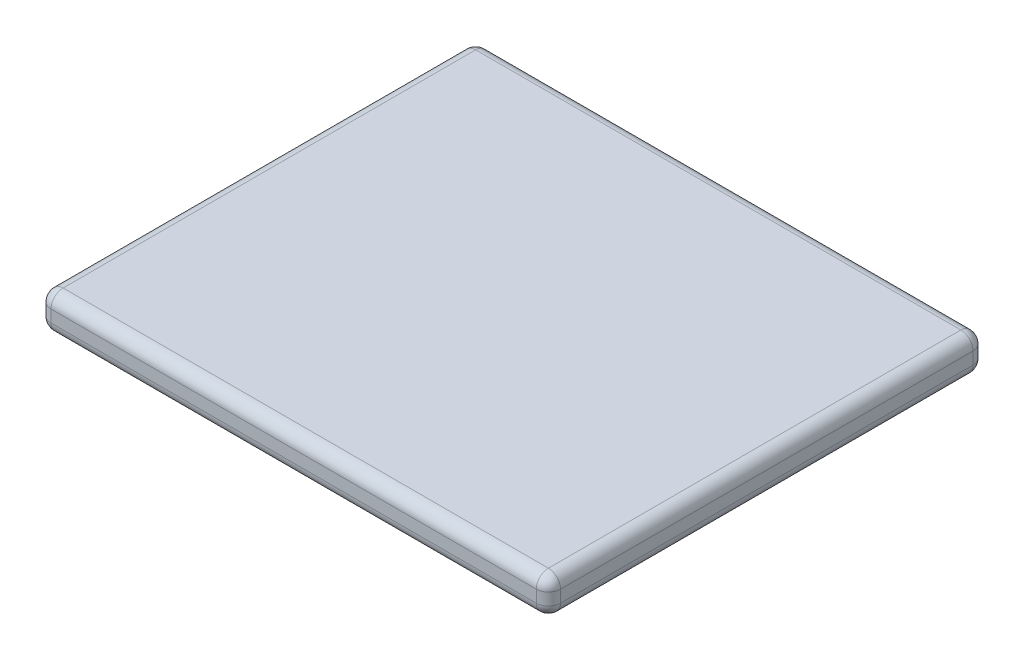
ISO-10303-21;
HEADER;
FILE_DESCRIPTION(('STEP AP214'),'2;1');
FILE_NAME('part.step','',(''),(''),'','','');
FILE_SCHEMA(('AUTOMOTIVE_DESIGN { 1 0 10303 214 1 1 1 1 }'));
ENDSEC;
DATA;
#1=APPLICATION_CONTEXT('core data for automotive mechanical design processes');
#2=APPLICATION_PROTOCOL_DEFINITION('international standard','automotive_design',2000,#1);
#3=PRODUCT_CONTEXT('',#1,'mechanical');
#4=PRODUCT('Part','Part','',(#3));
#5=PRODUCT_RELATED_PRODUCT_CATEGORY('part','',(#4));
#6=PRODUCT_DEFINITION_FORMATION('','',#4);
#7=PRODUCT_DEFINITION_CONTEXT('part definition',#1,'design');
#8=PRODUCT_DEFINITION('design','',#6,#7);
#9=PRODUCT_DEFINITION_SHAPE('','',#8);
#10=(LENGTH_UNIT() NAMED_UNIT(*) SI_UNIT(.MILLI.,.METRE.));
#11=(NAMED_UNIT(*) PLANE_ANGLE_UNIT() SI_UNIT($,.RADIAN.));
#12=(NAMED_UNIT(*) SI_UNIT($,.STERADIAN.) SOLID_ANGLE_UNIT());
#13=UNCERTAINTY_MEASURE_WITH_UNIT(LENGTH_MEASURE(1.E-05),#10,'distance_accuracy_value','');
#14=(GEOMETRIC_REPRESENTATION_CONTEXT(3) GLOBAL_UNCERTAINTY_ASSIGNED_CONTEXT((#13)) GLOBAL_UNIT_ASSIGNED_CONTEXT((#10,
#11,#12)) REPRESENTATION_CONTEXT('',''));
#15=CARTESIAN_POINT('',(0.,0.,0.));
#16=DIRECTION('',(0.,0.,1.));
#17=DIRECTION('',(1.,0.,0.));
#18=AXIS2_PLACEMENT_3D('',#15,#16,#17);
#19=CARTESIAN_POINT('',(-40.,6.,34.));
#20=DIRECTION('',(0.,-1.,0.));
#21=DIRECTION('',(0.,0.,-1.));
#22=AXIS2_PLACEMENT_3D('',#19,#20,#21);
#23=CYLINDRICAL_SURFACE('',#22,2.);
#24=DIRECTION('',(0.,-1.,0.));
#25=VECTOR('',#24,1.);
#26=CARTESIAN_POINT('',(-42.,6.,34.));
#27=LINE('',#26,#25);
#28=CARTESIAN_POINT('',(-42.,4.,34.));
#29=VERTEX_POINT('',#28);
#30=CARTESIAN_POINT('',(-42.,2.,34.));
#31=VERTEX_POINT('',#30);
#32=EDGE_CURVE('E225',#29,#31,#27,.T.);
#33=ORIENTED_EDGE('',*,*,#32,.T.);
#34=CARTESIAN_POINT('',(-40.,2.,34.));
#35=DIRECTION('',(0.,-1.,0.));
#36=DIRECTION('',(0.,0.,-1.));
#37=AXIS2_PLACEMENT_3D('',#34,#35,#36);
#38=CIRCLE('',#37,2.);
#39=CARTESIAN_POINT('',(-40.,2.,36.));
#40=VERTEX_POINT('',#39);
#41=EDGE_CURVE('E174',#31,#40,#38,.F.);
#42=ORIENTED_EDGE('',*,*,#41,.T.);
#43=DIRECTION('',(0.,-1.,0.));
#44=VECTOR('',#43,1.);
#45=CARTESIAN_POINT('',(-40.,6.,36.));
#46=LINE('',#45,#44);
#47=CARTESIAN_POINT('',(-40.,4.,36.));
#48=VERTEX_POINT('',#47);
#49=EDGE_CURVE('E157',#48,#40,#46,.T.);
#50=ORIENTED_EDGE('',*,*,#49,.F.);
#51=CARTESIAN_POINT('',(-40.,4.,34.));
#52=DIRECTION('',(0.,-1.,0.));
#53=DIRECTION('',(0.,0.,-1.));
#54=AXIS2_PLACEMENT_3D('',#51,#52,#53);
#55=CIRCLE('',#54,2.);
#56=EDGE_CURVE('E172',#48,#29,#55,.T.);
#57=ORIENTED_EDGE('',*,*,#56,.T.);
#58=EDGE_LOOP('',(#33,#42,#50,#57));
#59=FACE_BOUND('',#58,.T.);
#60=ADVANCED_FACE('F35',(#59),#23,.T.);
#61=CARTESIAN_POINT('',(-40.,6.,36.));
#62=DIRECTION('',(0.,0.,-1.));
#63=DIRECTION('',(-1.,0.,0.));
#64=AXIS2_PLACEMENT_3D('',#61,#62,#63);
#65=PLANE('',#64);
#66=ORIENTED_EDGE('',*,*,#49,.T.);
#67=DIRECTION('',(1.,0.,0.));
#68=VECTOR('',#67,1.);
#69=CARTESIAN_POINT('',(-40.,2.,36.));
#70=LINE('',#69,#68);
#71=CARTESIAN_POINT('',(40.,2.,36.));
#72=VERTEX_POINT('',#71);
#73=EDGE_CURVE('E196',#40,#72,#70,.T.);
#74=ORIENTED_EDGE('',*,*,#73,.T.);
#75=DIRECTION('',(0.,-1.,0.));
#76=VECTOR('',#75,1.);
#77=CARTESIAN_POINT('',(40.,6.,36.));
#78=LINE('',#77,#76);
#79=CARTESIAN_POINT('',(40.,4.,36.));
#80=VERTEX_POINT('',#79);
#81=EDGE_CURVE('E146',#80,#72,#78,.T.);
#82=ORIENTED_EDGE('',*,*,#81,.F.);
#83=DIRECTION('',(1.,0.,0.));
#84=VECTOR('',#83,1.);
#85=CARTESIAN_POINT('',(-40.,4.,36.));
#86=LINE('',#85,#84);
#87=EDGE_CURVE('E194',#80,#48,#86,.F.);
#88=ORIENTED_EDGE('',*,*,#87,.T.);
#89=EDGE_LOOP('',(#66,#74,#82,#88));
#90=FACE_BOUND('',#89,.T.);
#91=ADVANCED_FACE('F328',(#90),#65,.F.);
#92=CARTESIAN_POINT('',(40.,6.,34.));
#93=DIRECTION('',(0.,-1.,0.));
#94=DIRECTION('',(0.,0.,-1.));
#95=AXIS2_PLACEMENT_3D('',#92,#93,#94);
#96=CYLINDRICAL_SURFACE('',#95,2.);
#97=ORIENTED_EDGE('',*,*,#81,.T.);
#98=CARTESIAN_POINT('',(40.,2.,34.));
#99=DIRECTION('',(0.,-1.,0.));
#100=DIRECTION('',(0.,0.,-1.));
#101=AXIS2_PLACEMENT_3D('',#98,#99,#100);
#102=CIRCLE('',#101,2.);
#103=CARTESIAN_POINT('',(42.,2.,34.));
#104=VERTEX_POINT('',#103);
#105=EDGE_CURVE('E145',#72,#104,#102,.F.);
#106=ORIENTED_EDGE('',*,*,#105,.T.);
#107=DIRECTION('',(0.,-1.,0.));
#108=VECTOR('',#107,1.);
#109=CARTESIAN_POINT('',(42.,6.,34.));
#110=LINE('',#109,#108);
#111=CARTESIAN_POINT('',(42.,4.,34.));
#112=VERTEX_POINT('',#111);
#113=EDGE_CURVE('E128',#112,#104,#110,.T.);
#114=ORIENTED_EDGE('',*,*,#113,.F.);
#115=CARTESIAN_POINT('',(40.,4.,34.));
#116=DIRECTION('',(0.,-1.,0.));
#117=DIRECTION('',(0.,0.,-1.));
#118=AXIS2_PLACEMENT_3D('',#115,#116,#117);
#119=CIRCLE('',#118,2.);
#120=EDGE_CURVE('E142',#112,#80,#119,.T.);
#121=ORIENTED_EDGE('',*,*,#120,.T.);
#122=EDGE_LOOP('',(#97,#106,#114,#121));
#123=FACE_BOUND('',#122,.T.);
#124=ADVANCED_FACE('F140',(#123),#96,.T.);
#125=CARTESIAN_POINT('',(42.,6.,-34.));
#126=DIRECTION('',(-1.,0.,0.));
#127=DIRECTION('',(0.,0.,1.));
#128=AXIS2_PLACEMENT_3D('',#125,#126,#127);
#129=PLANE('',#128);
#130=ORIENTED_EDGE('',*,*,#113,.T.);
#131=DIRECTION('',(0.,0.,-1.));
#132=VECTOR('',#131,1.);
#133=CARTESIAN_POINT('',(42.,2.,-34.));
#134=LINE('',#133,#132);
#135=CARTESIAN_POINT('',(42.,2.,-34.));
#136=VERTEX_POINT('',#135);
#137=EDGE_CURVE('E134',#104,#136,#134,.T.);
#138=ORIENTED_EDGE('',*,*,#137,.T.);
#139=DIRECTION('',(0.,-1.,0.));
#140=VECTOR('',#139,1.);
#141=CARTESIAN_POINT('',(42.,6.,-34.));
#142=LINE('',#141,#140);
#143=CARTESIAN_POINT('',(42.,4.,-34.));
#144=VERTEX_POINT('',#143);
#145=EDGE_CURVE('E130',#144,#136,#142,.T.);
#146=ORIENTED_EDGE('',*,*,#145,.F.);
#147=DIRECTION('',(0.,0.,-1.));
#148=VECTOR('',#147,1.);
#149=CARTESIAN_POINT('',(42.,4.,34.));
#150=LINE('',#149,#148);
#151=EDGE_CURVE('E125',#144,#112,#150,.F.);
#152=ORIENTED_EDGE('',*,*,#151,.T.);
#153=EDGE_LOOP('',(#130,#138,#146,#152));
#154=FACE_BOUND('',#153,.T.);
#155=ADVANCED_FACE('F127',(#154),#129,.F.);
#156=CARTESIAN_POINT('',(40.,6.,-34.));
#157=DIRECTION('',(0.,-1.,0.));
#158=DIRECTION('',(0.,0.,-1.));
#159=AXIS2_PLACEMENT_3D('',#156,#157,#158);
#160=CYLINDRICAL_SURFACE('',#159,2.);
#161=ORIENTED_EDGE('',*,*,#145,.T.);
#162=CARTESIAN_POINT('',(40.,2.,-34.));
#163=DIRECTION('',(0.,-1.,0.));
#164=DIRECTION('',(0.,0.,-1.));
#165=AXIS2_PLACEMENT_3D('',#162,#163,#164);
#166=CIRCLE('',#165,2.);
#167=CARTESIAN_POINT('',(40.,2.,-36.));
#168=VERTEX_POINT('',#167);
#169=EDGE_CURVE('E166',#136,#168,#166,.F.);
#170=ORIENTED_EDGE('',*,*,#169,.T.);
#171=DIRECTION('',(0.,-1.,0.));
#172=VECTOR('',#171,1.);
#173=CARTESIAN_POINT('',(40.,6.,-36.));
#174=LINE('',#173,#172);
#175=CARTESIAN_POINT('',(40.,4.,-36.));
#176=VERTEX_POINT('',#175);
#177=EDGE_CURVE('E250',#176,#168,#174,.T.);
#178=ORIENTED_EDGE('',*,*,#177,.F.);
#179=CARTESIAN_POINT('',(40.,4.,-34.));
#180=DIRECTION('',(0.,-1.,0.));
#181=DIRECTION('',(0.,0.,-1.));
#182=AXIS2_PLACEMENT_3D('',#179,#180,#181);
#183=CIRCLE('',#182,2.);
#184=EDGE_CURVE('E159',#176,#144,#183,.T.);
#185=ORIENTED_EDGE('',*,*,#184,.T.);
#186=EDGE_LOOP('',(#161,#170,#178,#185));
#187=FACE_BOUND('',#186,.T.);
#188=ADVANCED_FACE('F247',(#187),#160,.T.);
#189=CARTESIAN_POINT('',(-40.,6.,-36.));
#190=DIRECTION('',(0.,0.,1.));
#191=DIRECTION('',(1.,0.,0.));
#192=AXIS2_PLACEMENT_3D('',#189,#190,#191);
#193=PLANE('',#192);
#194=ORIENTED_EDGE('',*,*,#177,.T.);
#195=DIRECTION('',(-1.,0.,0.));
#196=VECTOR('',#195,1.);
#197=CARTESIAN_POINT('',(-40.,2.,-36.));
#198=LINE('',#197,#196);
#199=CARTESIAN_POINT('',(-40.,2.,-36.));
#200=VERTEX_POINT('',#199);
#201=EDGE_CURVE('E135',#168,#200,#198,.T.);
#202=ORIENTED_EDGE('',*,*,#201,.T.);
#203=DIRECTION('',(0.,-1.,0.));
#204=VECTOR('',#203,1.);
#205=CARTESIAN_POINT('',(-40.,6.,-36.));
#206=LINE('',#205,#204);
#207=CARTESIAN_POINT('',(-40.,4.,-36.));
#208=VERTEX_POINT('',#207);
#209=EDGE_CURVE('E253',#208,#200,#206,.T.);
#210=ORIENTED_EDGE('',*,*,#209,.F.);
#211=DIRECTION('',(-1.,0.,0.));
#212=VECTOR('',#211,1.);
#213=CARTESIAN_POINT('',(40.,4.,-36.));
#214=LINE('',#213,#212);
#215=EDGE_CURVE('E190',#208,#176,#214,.F.);
#216=ORIENTED_EDGE('',*,*,#215,.T.);
#217=EDGE_LOOP('',(#194,#202,#210,#216));
#218=FACE_BOUND('',#217,.T.);
#219=ADVANCED_FACE('F281',(#218),#193,.F.);
#220=CARTESIAN_POINT('',(-40.,6.,-34.));
#221=DIRECTION('',(0.,-1.,0.));
#222=DIRECTION('',(0.,0.,-1.));
#223=AXIS2_PLACEMENT_3D('',#220,#221,#222);
#224=CYLINDRICAL_SURFACE('',#223,2.);
#225=ORIENTED_EDGE('',*,*,#209,.T.);
#226=CARTESIAN_POINT('',(-40.,2.,-34.));
#227=DIRECTION('',(0.,-1.,0.));
#228=DIRECTION('',(0.,0.,-1.));
#229=AXIS2_PLACEMENT_3D('',#226,#227,#228);
#230=CIRCLE('',#229,2.);
#231=CARTESIAN_POINT('',(-42.,2.,-34.));
#232=VERTEX_POINT('',#231);
#233=EDGE_CURVE('E170',#200,#232,#230,.F.);
#234=ORIENTED_EDGE('',*,*,#233,.T.);
#235=DIRECTION('',(0.,-1.,0.));
#236=VECTOR('',#235,1.);
#237=CARTESIAN_POINT('',(-42.,6.,-34.));
#238=LINE('',#237,#236);
#239=CARTESIAN_POINT('',(-42.,4.,-34.));
#240=VERTEX_POINT('',#239);
#241=EDGE_CURVE('E257',#240,#232,#238,.T.);
#242=ORIENTED_EDGE('',*,*,#241,.F.);
#243=CARTESIAN_POINT('',(-40.,4.,-34.));
#244=DIRECTION('',(0.,-1.,0.));
#245=DIRECTION('',(0.,0.,-1.));
#246=AXIS2_PLACEMENT_3D('',#243,#244,#245);
#247=CIRCLE('',#246,2.);
#248=EDGE_CURVE('E168',#240,#208,#247,.T.);
#249=ORIENTED_EDGE('',*,*,#248,.T.);
#250=EDGE_LOOP('',(#225,#234,#242,#249));
#251=FACE_BOUND('',#250,.T.);
#252=ADVANCED_FACE('F284',(#251),#224,.T.);
#253=CARTESIAN_POINT('',(-42.,6.,-34.));
#254=DIRECTION('',(1.,0.,0.));
#255=DIRECTION('',(0.,0.,-1.));
#256=AXIS2_PLACEMENT_3D('',#253,#254,#255);
#257=PLANE('',#256);
#258=ORIENTED_EDGE('',*,*,#241,.T.);
#259=DIRECTION('',(0.,0.,1.));
#260=VECTOR('',#259,1.);
#261=CARTESIAN_POINT('',(-42.,2.,-34.));
#262=LINE('',#261,#260);
#263=EDGE_CURVE('E179',#232,#31,#262,.T.);
#264=ORIENTED_EDGE('',*,*,#263,.T.);
#265=ORIENTED_EDGE('',*,*,#32,.F.);
#266=DIRECTION('',(0.,0.,1.));
#267=VECTOR('',#266,1.);
#268=CARTESIAN_POINT('',(-42.,4.,-34.));
#269=LINE('',#268,#267);
#270=EDGE_CURVE('E176',#29,#240,#269,.F.);
#271=ORIENTED_EDGE('',*,*,#270,.T.);
#272=EDGE_LOOP('',(#258,#264,#265,#271));
#273=FACE_BOUND('',#272,.T.);
#274=ADVANCED_FACE('F300',(#273),#257,.F.);
#275=CARTESIAN_POINT('',(-40.,6.,34.));
#276=DIRECTION('',(0.,1.,0.));
#277=DIRECTION('',(0.,0.,1.));
#278=AXIS2_PLACEMENT_3D('',#275,#276,#277);
#279=PLANE('',#278);
#280=DIRECTION('',(-1.,0.,0.));
#281=VECTOR('',#280,1.);
#282=CARTESIAN_POINT('',(-40.,6.,-34.));
#283=LINE('',#282,#281);
#284=CARTESIAN_POINT('',(40.,6.,-34.));
#285=VERTEX_POINT('',#284);
#286=CARTESIAN_POINT('',(-40.,6.,-34.));
#287=VERTEX_POINT('',#286);
#288=EDGE_CURVE('E44',#285,#287,#283,.T.);
#289=ORIENTED_EDGE('',*,*,#288,.T.);
#290=DIRECTION('',(0.,0.,1.));
#291=VECTOR('',#290,1.);
#292=CARTESIAN_POINT('',(-40.,6.,34.));
#293=LINE('',#292,#291);
#294=CARTESIAN_POINT('',(-40.,6.,34.));
#295=VERTEX_POINT('',#294);
#296=EDGE_CURVE('E11',#287,#295,#293,.T.);
#297=ORIENTED_EDGE('',*,*,#296,.T.);
#298=DIRECTION('',(1.,0.,0.));
#299=VECTOR('',#298,1.);
#300=CARTESIAN_POINT('',(40.,6.,34.));
#301=LINE('',#300,#299);
#302=CARTESIAN_POINT('',(40.,6.,34.));
#303=VERTEX_POINT('',#302);
#304=EDGE_CURVE('E198',#295,#303,#301,.T.);
#305=ORIENTED_EDGE('',*,*,#304,.T.);
#306=DIRECTION('',(0.,0.,-1.));
#307=VECTOR('',#306,1.);
#308=CARTESIAN_POINT('',(40.,6.,-34.));
#309=LINE('',#308,#307);
#310=EDGE_CURVE('E55',#303,#285,#309,.T.);
#311=ORIENTED_EDGE('',*,*,#310,.T.);
#312=EDGE_LOOP('',(#289,#297,#305,#311));
#313=FACE_BOUND('',#312,.T.);
#314=ADVANCED_FACE('F459',(#313),#279,.T.);
#315=CARTESIAN_POINT('',(-40.,0.,34.));
#316=DIRECTION('',(0.,1.,0.));
#317=DIRECTION('',(0.,0.,1.));
#318=AXIS2_PLACEMENT_3D('',#315,#316,#317);
#319=PLANE('',#318);
#320=DIRECTION('',(1.,0.,0.));
#321=VECTOR('',#320,1.);
#322=CARTESIAN_POINT('',(-40.,0.,34.));
#323=LINE('',#322,#321);
#324=CARTESIAN_POINT('',(40.,0.,34.));
#325=VERTEX_POINT('',#324);
#326=CARTESIAN_POINT('',(-40.,0.,34.));
#327=VERTEX_POINT('',#326);
#328=EDGE_CURVE('E181',#325,#327,#323,.F.);
#329=ORIENTED_EDGE('',*,*,#328,.T.);
#330=DIRECTION('',(0.,0.,1.));
#331=VECTOR('',#330,1.);
#332=CARTESIAN_POINT('',(-40.,0.,34.));
#333=LINE('',#332,#331);
#334=CARTESIAN_POINT('',(-40.,0.,-34.));
#335=VERTEX_POINT('',#334);
#336=EDGE_CURVE('E187',#327,#335,#333,.F.);
#337=ORIENTED_EDGE('',*,*,#336,.T.);
#338=DIRECTION('',(-1.,0.,0.));
#339=VECTOR('',#338,1.);
#340=CARTESIAN_POINT('',(-40.,0.,-34.));
#341=LINE('',#340,#339);
#342=CARTESIAN_POINT('',(40.,0.,-34.));
#343=VERTEX_POINT('',#342);
#344=EDGE_CURVE('E185',#335,#343,#341,.F.);
#345=ORIENTED_EDGE('',*,*,#344,.T.);
#346=DIRECTION('',(0.,0.,-1.));
#347=VECTOR('',#346,1.);
#348=CARTESIAN_POINT('',(40.,0.,34.));
#349=LINE('',#348,#347);
#350=EDGE_CURVE('E183',#343,#325,#349,.F.);
#351=ORIENTED_EDGE('',*,*,#350,.T.);
#352=EDGE_LOOP('',(#329,#337,#345,#351));
#353=FACE_BOUND('',#352,.T.);
#354=ADVANCED_FACE('F354',(#353),#319,.F.);
#355=CARTESIAN_POINT('',(-40.,2.,-34.));
#356=DIRECTION('',(0.,1.,0.));
#357=DIRECTION('',(0.,0.,1.));
#358=AXIS2_PLACEMENT_3D('',#355,#356,#357);
#359=SPHERICAL_SURFACE('',#358,2.);
#360=CARTESIAN_POINT('',(-40.,2.,-34.));
#361=DIRECTION('',(1.,0.,0.));
#362=DIRECTION('',(0.,0.,-1.));
#363=AXIS2_PLACEMENT_3D('',#360,#361,#362);
#364=CIRCLE('',#363,2.);
#365=EDGE_CURVE('E219',#335,#200,#364,.T.);
#366=ORIENTED_EDGE('',*,*,#365,.F.);
#367=CARTESIAN_POINT('',(-40.,2.,-34.));
#368=DIRECTION('',(0.,0.,1.));
#369=DIRECTION('',(1.,0.,0.));
#370=AXIS2_PLACEMENT_3D('',#367,#368,#369);
#371=CIRCLE('',#370,2.);
#372=EDGE_CURVE('E222',#232,#335,#371,.T.);
#373=ORIENTED_EDGE('',*,*,#372,.F.);
#374=ORIENTED_EDGE('',*,*,#233,.F.);
#375=EDGE_LOOP('',(#366,#373,#374));
#376=FACE_BOUND('',#375,.T.);
#377=ADVANCED_FACE('F290',(#376),#359,.T.);
#378=CARTESIAN_POINT('',(-40.,2.,-34.));
#379=DIRECTION('',(0.,0.,1.));
#380=DIRECTION('',(1.,0.,0.));
#381=AXIS2_PLACEMENT_3D('',#378,#379,#380);
#382=CYLINDRICAL_SURFACE('',#381,2.);
#383=ORIENTED_EDGE('',*,*,#372,.T.);
#384=ORIENTED_EDGE('',*,*,#336,.F.);
#385=CARTESIAN_POINT('',(-40.,2.,34.));
#386=DIRECTION('',(0.,0.,1.));
#387=DIRECTION('',(0.,-1.,0.));
#388=AXIS2_PLACEMENT_3D('',#385,#386,#387);
#389=CIRCLE('',#388,2.);
#390=EDGE_CURVE('E216',#31,#327,#389,.T.);
#391=ORIENTED_EDGE('',*,*,#390,.F.);
#392=ORIENTED_EDGE('',*,*,#263,.F.);
#393=EDGE_LOOP('',(#383,#384,#391,#392));
#394=FACE_BOUND('',#393,.T.);
#395=ADVANCED_FACE('F295',(#394),#382,.T.);
#396=CARTESIAN_POINT('',(-40.,2.,-34.));
#397=DIRECTION('',(-1.,0.,0.));
#398=DIRECTION('',(0.,0.,1.));
#399=AXIS2_PLACEMENT_3D('',#396,#397,#398);
#400=CYLINDRICAL_SURFACE('',#399,2.);
#401=ORIENTED_EDGE('',*,*,#365,.T.);
#402=ORIENTED_EDGE('',*,*,#201,.F.);
#403=CARTESIAN_POINT('',(40.,2.,-34.));
#404=DIRECTION('',(1.,0.,0.));
#405=DIRECTION('',(0.,0.,-1.));
#406=AXIS2_PLACEMENT_3D('',#403,#404,#405);
#407=CIRCLE('',#406,2.);
#408=EDGE_CURVE('E213',#343,#168,#407,.T.);
#409=ORIENTED_EDGE('',*,*,#408,.F.);
#410=ORIENTED_EDGE('',*,*,#344,.F.);
#411=EDGE_LOOP('',(#401,#402,#409,#410));
#412=FACE_BOUND('',#411,.T.);
#413=ADVANCED_FACE('F278',(#412),#400,.T.);
#414=CARTESIAN_POINT('',(-40.,2.,34.));
#415=DIRECTION('',(0.,1.,0.));
#416=DIRECTION('',(0.,0.,1.));
#417=AXIS2_PLACEMENT_3D('',#414,#415,#416);
#418=SPHERICAL_SURFACE('',#417,2.);
#419=ORIENTED_EDGE('',*,*,#41,.F.);
#420=ORIENTED_EDGE('',*,*,#390,.T.);
#421=CARTESIAN_POINT('',(-40.,2.,34.));
#422=DIRECTION('',(1.,0.,0.));
#423=DIRECTION('',(0.,0.,-1.));
#424=AXIS2_PLACEMENT_3D('',#421,#422,#423);
#425=CIRCLE('',#424,2.);
#426=EDGE_CURVE('E210',#40,#327,#425,.T.);
#427=ORIENTED_EDGE('',*,*,#426,.F.);
#428=EDGE_LOOP('',(#419,#420,#427));
#429=FACE_BOUND('',#428,.T.);
#430=ADVANCED_FACE('F344',(#429),#418,.T.);
#431=CARTESIAN_POINT('',(40.,2.,-34.));
#432=DIRECTION('',(0.,1.,0.));
#433=DIRECTION('',(0.,0.,1.));
#434=AXIS2_PLACEMENT_3D('',#431,#432,#433);
#435=SPHERICAL_SURFACE('',#434,2.);
#436=ORIENTED_EDGE('',*,*,#408,.T.);
#437=ORIENTED_EDGE('',*,*,#169,.F.);
#438=CARTESIAN_POINT('',(40.,2.,-34.));
#439=DIRECTION('',(0.,0.,1.));
#440=DIRECTION('',(1.,0.,0.));
#441=AXIS2_PLACEMENT_3D('',#438,#439,#440);
#442=CIRCLE('',#441,2.);
#443=EDGE_CURVE('E207',#343,#136,#442,.T.);
#444=ORIENTED_EDGE('',*,*,#443,.F.);
#445=EDGE_LOOP('',(#436,#437,#444));
#446=FACE_BOUND('',#445,.T.);
#447=ADVANCED_FACE('F275',(#446),#435,.T.);
#448=CARTESIAN_POINT('',(-40.,2.,34.));
#449=DIRECTION('',(1.,0.,0.));
#450=DIRECTION('',(0.,0.,-1.));
#451=AXIS2_PLACEMENT_3D('',#448,#449,#450);
#452=CYLINDRICAL_SURFACE('',#451,2.);
#453=ORIENTED_EDGE('',*,*,#426,.T.);
#454=ORIENTED_EDGE('',*,*,#328,.F.);
#455=CARTESIAN_POINT('',(40.,2.,34.));
#456=DIRECTION('',(1.,0.,0.));
#457=DIRECTION('',(0.,1.,0.));
#458=AXIS2_PLACEMENT_3D('',#455,#456,#457);
#459=CIRCLE('',#458,2.);
#460=EDGE_CURVE('E204',#72,#325,#459,.T.);
#461=ORIENTED_EDGE('',*,*,#460,.F.);
#462=ORIENTED_EDGE('',*,*,#73,.F.);
#463=EDGE_LOOP('',(#453,#454,#461,#462));
#464=FACE_BOUND('',#463,.T.);
#465=ADVANCED_FACE('F265',(#464),#452,.T.);
#466=CARTESIAN_POINT('',(40.,2.,-34.));
#467=DIRECTION('',(0.,0.,-1.));
#468=DIRECTION('',(-1.,0.,0.));
#469=AXIS2_PLACEMENT_3D('',#466,#467,#468);
#470=CYLINDRICAL_SURFACE('',#469,2.);
#471=ORIENTED_EDGE('',*,*,#443,.T.);
#472=ORIENTED_EDGE('',*,*,#137,.F.);
#473=CARTESIAN_POINT('',(40.,2.,34.));
#474=DIRECTION('',(0.,0.,1.));
#475=DIRECTION('',(1.,0.,0.));
#476=AXIS2_PLACEMENT_3D('',#473,#474,#475);
#477=CIRCLE('',#476,2.);
#478=EDGE_CURVE('E202',#325,#104,#477,.T.);
#479=ORIENTED_EDGE('',*,*,#478,.F.);
#480=ORIENTED_EDGE('',*,*,#350,.F.);
#481=EDGE_LOOP('',(#471,#472,#479,#480));
#482=FACE_BOUND('',#481,.T.);
#483=ADVANCED_FACE('F272',(#482),#470,.T.);
#484=CARTESIAN_POINT('',(40.,2.,34.));
#485=DIRECTION('',(0.,1.,0.));
#486=DIRECTION('',(0.,0.,1.));
#487=AXIS2_PLACEMENT_3D('',#484,#485,#486);
#488=SPHERICAL_SURFACE('',#487,2.);
#489=ORIENTED_EDGE('',*,*,#105,.F.);
#490=ORIENTED_EDGE('',*,*,#460,.T.);
#491=ORIENTED_EDGE('',*,*,#478,.T.);
#492=EDGE_LOOP('',(#489,#490,#491));
#493=FACE_BOUND('',#492,.T.);
#494=ADVANCED_FACE('F268',(#493),#488,.T.);
#495=CARTESIAN_POINT('',(40.,4.,34.));
#496=DIRECTION('',(0.,0.,1.));
#497=DIRECTION('',(1.,0.,0.));
#498=AXIS2_PLACEMENT_3D('',#495,#496,#497);
#499=CYLINDRICAL_SURFACE('',#498,2.);
#500=CARTESIAN_POINT('',(40.,4.,34.));
#501=DIRECTION('',(0.,0.,1.));
#502=DIRECTION('',(1.,0.,0.));
#503=AXIS2_PLACEMENT_3D('',#500,#501,#502);
#504=CIRCLE('',#503,2.);
#505=EDGE_CURVE('E149',#112,#303,#504,.T.);
#506=ORIENTED_EDGE('',*,*,#505,.F.);
#507=ORIENTED_EDGE('',*,*,#151,.F.);
#508=CARTESIAN_POINT('',(40.,4.,-34.));
#509=DIRECTION('',(0.,0.,-1.));
#510=DIRECTION('',(-1.,0.,0.));
#511=AXIS2_PLACEMENT_3D('',#508,#509,#510);
#512=CIRCLE('',#511,2.);
#513=EDGE_CURVE('E39',#285,#144,#512,.T.);
#514=ORIENTED_EDGE('',*,*,#513,.F.);
#515=ORIENTED_EDGE('',*,*,#310,.F.);
#516=EDGE_LOOP('',(#506,#507,#514,#515));
#517=FACE_BOUND('',#516,.T.);
#518=ADVANCED_FACE('F37',(#517),#499,.T.);
#519=CARTESIAN_POINT('',(40.,4.,-34.));
#520=DIRECTION('',(0.,1.,0.));
#521=DIRECTION('',(0.,0.,1.));
#522=AXIS2_PLACEMENT_3D('',#519,#520,#521);
#523=SPHERICAL_SURFACE('',#522,2.);
#524=ORIENTED_EDGE('',*,*,#513,.T.);
#525=ORIENTED_EDGE('',*,*,#184,.F.);
#526=CARTESIAN_POINT('',(40.,4.,-34.));
#527=DIRECTION('',(-1.,0.,0.));
#528=DIRECTION('',(0.,0.,1.));
#529=AXIS2_PLACEMENT_3D('',#526,#527,#528);
#530=CIRCLE('',#529,2.);
#531=EDGE_CURVE('E153',#285,#176,#530,.T.);
#532=ORIENTED_EDGE('',*,*,#531,.F.);
#533=EDGE_LOOP('',(#524,#525,#532));
#534=FACE_BOUND('',#533,.T.);
#535=ADVANCED_FACE('F244',(#534),#523,.T.);
#536=CARTESIAN_POINT('',(40.,4.,34.));
#537=DIRECTION('',(0.,1.,0.));
#538=DIRECTION('',(0.,0.,1.));
#539=AXIS2_PLACEMENT_3D('',#536,#537,#538);
#540=SPHERICAL_SURFACE('',#539,2.);
#541=ORIENTED_EDGE('',*,*,#120,.F.);
#542=ORIENTED_EDGE('',*,*,#505,.T.);
#543=CARTESIAN_POINT('',(40.,4.,34.));
#544=DIRECTION('',(-1.,0.,0.));
#545=DIRECTION('',(0.,0.,1.));
#546=AXIS2_PLACEMENT_3D('',#543,#544,#545);
#547=CIRCLE('',#546,2.);
#548=EDGE_CURVE('E155',#80,#303,#547,.T.);
#549=ORIENTED_EDGE('',*,*,#548,.F.);
#550=EDGE_LOOP('',(#541,#542,#549));
#551=FACE_BOUND('',#550,.T.);
#552=ADVANCED_FACE('F154',(#551),#540,.T.);
#553=CARTESIAN_POINT('',(-40.,4.,-34.));
#554=DIRECTION('',(1.,0.,0.));
#555=DIRECTION('',(0.,0.,-1.));
#556=AXIS2_PLACEMENT_3D('',#553,#554,#555);
#557=CYLINDRICAL_SURFACE('',#556,2.);
#558=ORIENTED_EDGE('',*,*,#531,.T.);
#559=ORIENTED_EDGE('',*,*,#215,.F.);
#560=CARTESIAN_POINT('',(-40.,4.,-34.));
#561=DIRECTION('',(-1.,0.,0.));
#562=DIRECTION('',(0.,0.,1.));
#563=AXIS2_PLACEMENT_3D('',#560,#561,#562);
#564=CIRCLE('',#563,2.);
#565=EDGE_CURVE('E233',#287,#208,#564,.T.);
#566=ORIENTED_EDGE('',*,*,#565,.F.);
#567=ORIENTED_EDGE('',*,*,#288,.F.);
#568=EDGE_LOOP('',(#558,#559,#566,#567));
#569=FACE_BOUND('',#568,.T.);
#570=ADVANCED_FACE('F241',(#569),#557,.T.);
#571=CARTESIAN_POINT('',(-40.,4.,34.));
#572=DIRECTION('',(-1.,0.,0.));
#573=DIRECTION('',(0.,0.,1.));
#574=AXIS2_PLACEMENT_3D('',#571,#572,#573);
#575=CYLINDRICAL_SURFACE('',#574,2.);
#576=ORIENTED_EDGE('',*,*,#548,.T.);
#577=ORIENTED_EDGE('',*,*,#304,.F.);
#578=CARTESIAN_POINT('',(-40.,4.,34.));
#579=DIRECTION('',(-1.,0.,0.));
#580=DIRECTION('',(0.,0.,1.));
#581=AXIS2_PLACEMENT_3D('',#578,#579,#580);
#582=CIRCLE('',#581,2.);
#583=EDGE_CURVE('E230',#48,#295,#582,.T.);
#584=ORIENTED_EDGE('',*,*,#583,.F.);
#585=ORIENTED_EDGE('',*,*,#87,.F.);
#586=EDGE_LOOP('',(#576,#577,#584,#585));
#587=FACE_BOUND('',#586,.T.);
#588=ADVANCED_FACE('F318',(#587),#575,.T.);
#589=CARTESIAN_POINT('',(-40.,4.,-34.));
#590=DIRECTION('',(0.,1.,0.));
#591=DIRECTION('',(0.,0.,1.));
#592=AXIS2_PLACEMENT_3D('',#589,#590,#591);
#593=SPHERICAL_SURFACE('',#592,2.);
#594=ORIENTED_EDGE('',*,*,#565,.T.);
#595=ORIENTED_EDGE('',*,*,#248,.F.);
#596=CARTESIAN_POINT('',(-40.,4.,-34.));
#597=DIRECTION('',(0.,0.,1.));
#598=DIRECTION('',(1.,0.,0.));
#599=AXIS2_PLACEMENT_3D('',#596,#597,#598);
#600=CIRCLE('',#599,2.);
#601=EDGE_CURVE('E228',#287,#240,#600,.T.);
#602=ORIENTED_EDGE('',*,*,#601,.F.);
#603=EDGE_LOOP('',(#594,#595,#602));
#604=FACE_BOUND('',#603,.T.);
#605=ADVANCED_FACE('F316',(#604),#593,.T.);
#606=CARTESIAN_POINT('',(-40.,4.,34.));
#607=DIRECTION('',(0.,1.,0.));
#608=DIRECTION('',(0.,0.,1.));
#609=AXIS2_PLACEMENT_3D('',#606,#607,#608);
#610=SPHERICAL_SURFACE('',#609,2.);
#611=ORIENTED_EDGE('',*,*,#56,.F.);
#612=ORIENTED_EDGE('',*,*,#583,.T.);
#613=CARTESIAN_POINT('',(-40.,4.,34.));
#614=DIRECTION('',(0.,0.,-1.));
#615=DIRECTION('',(-1.,0.,0.));
#616=AXIS2_PLACEMENT_3D('',#613,#614,#615);
#617=CIRCLE('',#616,2.);
#618=EDGE_CURVE('E226',#29,#295,#617,.T.);
#619=ORIENTED_EDGE('',*,*,#618,.F.);
#620=EDGE_LOOP('',(#611,#612,#619));
#621=FACE_BOUND('',#620,.T.);
#622=ADVANCED_FACE('F309',(#621),#610,.T.);
#623=CARTESIAN_POINT('',(-40.,4.,34.));
#624=DIRECTION('',(0.,0.,-1.));
#625=DIRECTION('',(-1.,0.,0.));
#626=AXIS2_PLACEMENT_3D('',#623,#624,#625);
#627=CYLINDRICAL_SURFACE('',#626,2.);
#628=ORIENTED_EDGE('',*,*,#601,.T.);
#629=ORIENTED_EDGE('',*,*,#270,.F.);
#630=ORIENTED_EDGE('',*,*,#618,.T.);
#631=ORIENTED_EDGE('',*,*,#296,.F.);
#632=EDGE_LOOP('',(#628,#629,#630,#631));
#633=FACE_BOUND('',#632,.T.);
#634=ADVANCED_FACE('F313',(#633),#627,.T.);
#635=CLOSED_SHELL('',(#60,#91,#124,#155,#188,#219,#252,#274,#314,#354,#377,#395,#413,#430,#447,
#465,#483,#494,#518,#535,#552,#570,#588,#605,#622,#634));
#636=MANIFOLD_SOLID_BREP('B2',#635);
#637=ADVANCED_BREP_SHAPE_REPRESENTATION('',(#18,#636),#14);
#638=SHAPE_DEFINITION_REPRESENTATION(#9,#637);
ENDSEC;
END-ISO-10303-21;
